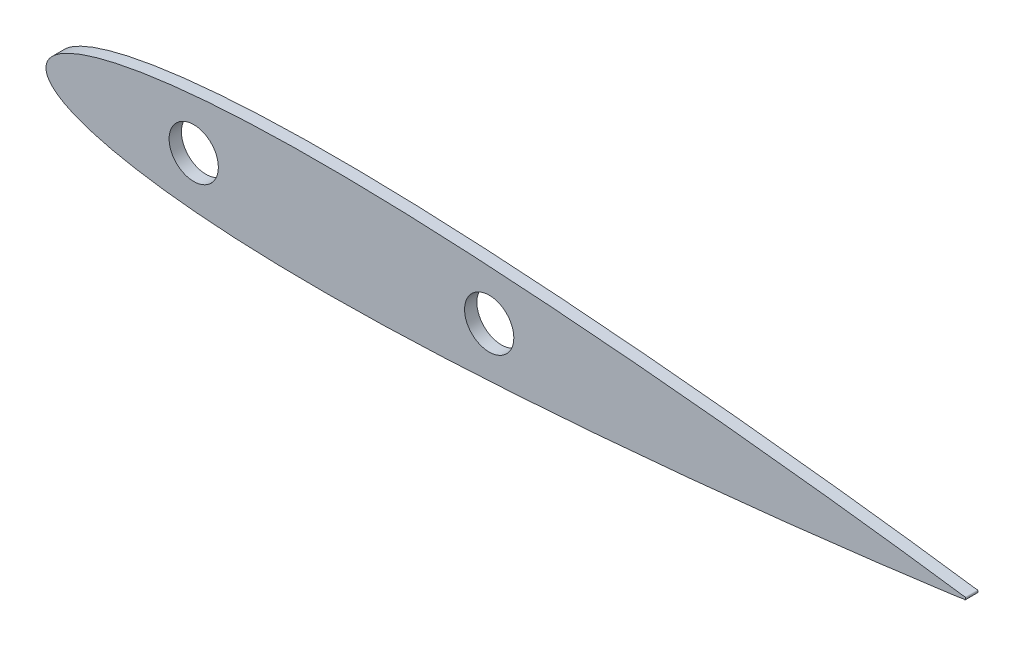
ISO-10303-21;
HEADER;
FILE_DESCRIPTION(('STEP AP214'),'2;1');
FILE_NAME('part.step','',(''),(''),'','','');
FILE_SCHEMA(('AUTOMOTIVE_DESIGN { 1 0 10303 214 1 1 1 1 }'));
ENDSEC;
DATA;
#1=APPLICATION_CONTEXT('core data for automotive mechanical design processes');
#2=APPLICATION_PROTOCOL_DEFINITION('international standard','automotive_design',2000,#1);
#3=PRODUCT_CONTEXT('',#1,'mechanical');
#4=PRODUCT('Part','Part','',(#3));
#5=PRODUCT_RELATED_PRODUCT_CATEGORY('part','',(#4));
#6=PRODUCT_DEFINITION_FORMATION('','',#4);
#7=PRODUCT_DEFINITION_CONTEXT('part definition',#1,'design');
#8=PRODUCT_DEFINITION('design','',#6,#7);
#9=PRODUCT_DEFINITION_SHAPE('','',#8);
#10=(LENGTH_UNIT() NAMED_UNIT(*) SI_UNIT(.MILLI.,.METRE.));
#11=(NAMED_UNIT(*) PLANE_ANGLE_UNIT() SI_UNIT($,.RADIAN.));
#12=(NAMED_UNIT(*) SI_UNIT($,.STERADIAN.) SOLID_ANGLE_UNIT());
#13=UNCERTAINTY_MEASURE_WITH_UNIT(LENGTH_MEASURE(1.E-05),#10,'distance_accuracy_value','');
#14=(GEOMETRIC_REPRESENTATION_CONTEXT(3) GLOBAL_UNCERTAINTY_ASSIGNED_CONTEXT((#13)) GLOBAL_UNIT_ASSIGNED_CONTEXT((#10,
#11,#12)) REPRESENTATION_CONTEXT('',''));
#15=CARTESIAN_POINT('',(0.,0.,0.));
#16=DIRECTION('',(0.,0.,1.));
#17=DIRECTION('',(1.,0.,0.));
#18=AXIS2_PLACEMENT_3D('',#15,#16,#17);
#19=CARTESIAN_POINT('',(237.0836,0.298725336,-3.175));
#20=CARTESIAN_POINT('',(236.995594177064,0.372475408342833,-3.175));
#21=CARTESIAN_POINT('',(236.426976915333,0.302841036144174,-3.175));
#22=CARTESIAN_POINT('',(235.41441473791,0.58787825322186,-3.175));
#23=CARTESIAN_POINT('',(233.557510405931,0.764057301815469,-3.175));
#24=CARTESIAN_POINT('',(231.055978259044,1.14215915390771,-3.175));
#25=CARTESIAN_POINT('',(227.833630131041,1.56409556437414,-3.175));
#26=CARTESIAN_POINT('',(223.947681724934,2.08411279295066,-3.175));
#27=CARTESIAN_POINT('',(219.408243113523,2.67194286821277,-3.175));
#28=CARTESIAN_POINT('',(214.248186400854,3.3264154433565,-3.175));
#29=CARTESIAN_POINT('',(208.497669056434,4.03606524010362,-3.175));
#30=CARTESIAN_POINT('',(202.192664292081,4.79128816807731,-3.175));
#31=CARTESIAN_POINT('',(195.371926846981,5.5827172587729,-3.175));
#32=CARTESIAN_POINT('',(188.077459080505,6.39957740326463,-3.175));
#33=CARTESIAN_POINT('',(180.354259346135,7.23189540042881,-3.175));
#34=CARTESIAN_POINT('',(172.249998357399,8.06933375412243,-3.175));
#35=CARTESIAN_POINT('',(163.814621862154,8.90108319346206,-3.175));
#36=CARTESIAN_POINT('',(155.100159759816,9.71546845477633,-3.175));
#37=CARTESIAN_POINT('',(146.160279483536,10.5017983401667,-3.175));
#38=CARTESIAN_POINT('',(137.050196099232,11.2469268213346,-3.175));
#39=CARTESIAN_POINT('',(127.825887084772,11.938704548657,-3.175));
#40=CARTESIAN_POINT('',(118.544307175963,12.564288116668,-3.175));
#41=CARTESIAN_POINT('',(109.262643888939,13.1105971127119,-3.175));
#42=CARTESIAN_POINT('',(100.038037253464,13.563829728713,-3.175));
#43=CARTESIAN_POINT('',(90.9274581455417,13.9119000953402,-3.175));
#44=CARTESIAN_POINT('',(81.9868134878278,14.1434528505076,-3.175));
#45=CARTESIAN_POINT('',(73.2713546398796,14.2471780807204,-3.175));
#46=CARTESIAN_POINT('',(64.8346344903156,14.2148441078441,-3.175));
#47=CARTESIAN_POINT('',(56.7286676185947,14.0402053636085,-3.175));
#48=CARTESIAN_POINT('',(49.0033499510361,13.7188349467634,-3.175));
#49=CARTESIAN_POINT('',(41.7062322985072,13.2498922023958,-3.175));
#50=CARTESIAN_POINT('',(34.8821630118159,12.6347881482418,-3.175));
#51=CARTESIAN_POINT('',(28.5729005372088,11.8783267733156,-3.175));
#52=CARTESIAN_POINT('',(22.8169018512922,10.9869444443621,-3.175));
#53=CARTESIAN_POINT('',(17.6490469137659,9.96995088795665,-3.175));
#54=CARTESIAN_POINT('',(13.0996252335267,8.83884552174934,-3.175));
#55=CARTESIAN_POINT('',(9.19448859826564,7.60465803357858,-3.175));
#56=CARTESIAN_POINT('',(5.95347766425118,6.27888316579985,-3.175));
#57=CARTESIAN_POINT('',(3.38692810552131,4.87049040865518,-3.175));
#58=CARTESIAN_POINT('',(1.49878923010834,3.37670002922291,-3.175));
#59=CARTESIAN_POINT('',(0.289451642221712,1.76137384384579,-3.175));
#60=CARTESIAN_POINT('',(-0.134894756530488,0.,-3.175));
#61=CARTESIAN_POINT('',(0.289451642221708,-1.76137384384578,-3.175));
#62=CARTESIAN_POINT('',(1.49878923010833,-3.3767000292229,-3.175));
#63=CARTESIAN_POINT('',(3.38692810552134,-4.8704904086552,-3.175));
#64=CARTESIAN_POINT('',(5.95347766425114,-6.27888316579983,-3.175));
#65=CARTESIAN_POINT('',(9.19448859826567,-7.60465803357859,-3.175));
#66=CARTESIAN_POINT('',(13.0996252335267,-8.83884552174934,-3.175));
#67=CARTESIAN_POINT('',(17.6490469137659,-9.96995088795666,-3.175));
#68=CARTESIAN_POINT('',(22.8169018512922,-10.9869444443621,-3.175));
#69=CARTESIAN_POINT('',(28.5729005372088,-11.8783267733156,-3.175));
#70=CARTESIAN_POINT('',(34.8821630118159,-12.6347881482418,-3.175));
#71=CARTESIAN_POINT('',(41.7062322985073,-13.2498922023958,-3.175));
#72=CARTESIAN_POINT('',(49.0033499510361,-13.7188349467634,-3.175));
#73=CARTESIAN_POINT('',(56.7286676185946,-14.0402053636085,-3.175));
#74=CARTESIAN_POINT('',(64.8346344903157,-14.2148441078441,-3.175));
#75=CARTESIAN_POINT('',(73.2713546398795,-14.2471780807204,-3.175));
#76=CARTESIAN_POINT('',(81.9868134878278,-14.1434528505076,-3.175));
#77=CARTESIAN_POINT('',(90.9274581455417,-13.9119000953402,-3.175));
#78=CARTESIAN_POINT('',(100.038037253464,-13.563829728713,-3.175));
#79=CARTESIAN_POINT('',(109.262643888939,-13.1105971127119,-3.175));
#80=CARTESIAN_POINT('',(118.544307175963,-12.564288116668,-3.175));
#81=CARTESIAN_POINT('',(127.825887084772,-11.938704548657,-3.175));
#82=CARTESIAN_POINT('',(137.050196099232,-11.2469268213346,-3.175));
#83=CARTESIAN_POINT('',(146.160279483536,-10.5017983401667,-3.175));
#84=CARTESIAN_POINT('',(155.100159759816,-9.71546845477633,-3.175));
#85=CARTESIAN_POINT('',(163.814621862154,-8.90108319346206,-3.175));
#86=CARTESIAN_POINT('',(172.249998357399,-8.06933375412243,-3.175));
#87=CARTESIAN_POINT('',(180.354259346135,-7.23189540042882,-3.175));
#88=CARTESIAN_POINT('',(188.077459080506,-6.39957740326463,-3.175));
#89=CARTESIAN_POINT('',(195.371926846981,-5.5827172587729,-3.175));
#90=CARTESIAN_POINT('',(202.192664292081,-4.79128816807731,-3.175));
#91=CARTESIAN_POINT('',(208.497669056435,-4.03606524010363,-3.175));
#92=CARTESIAN_POINT('',(214.248186400854,-3.32641544335649,-3.175));
#93=CARTESIAN_POINT('',(219.408243113523,-2.67194286821277,-3.175));
#94=CARTESIAN_POINT('',(223.947681724933,-2.08411279295066,-3.175));
#95=CARTESIAN_POINT('',(227.833630131041,-1.56409556437413,-3.175));
#96=CARTESIAN_POINT('',(231.055978259044,-1.14215915390771,-3.175));
#97=CARTESIAN_POINT('',(233.557510405931,-0.764057301815473,-3.175));
#98=CARTESIAN_POINT('',(235.41441473791,-0.587878253221858,-3.175));
#99=CARTESIAN_POINT('',(236.426976915333,-0.302841036144166,-3.175));
#100=CARTESIAN_POINT('',(237.226122794749,-0.400706551937491,-3.175));
#101=CARTESIAN_POINT('',(237.226122794749,0.179289302422103,-3.175));
#102=CARTESIAN_POINT('',(237.0836,0.298725336,-3.175));
#103=B_SPLINE_CURVE_WITH_KNOTS('',3,(#19,#20,#21,#22,#23,#24,#25,#26,#27,#28,#29,#30,#31,#32,
#33,#34,#35,#36,#37,#38,#39,#40,#41,#42,#43,#44,#45,#46,#47,#48,#49,#50,#51,#52,#53,#54,#55,#56,
#57,#58,#59,#60,#61,#62,#63,#64,#65,#66,#67,#68,#69,#70,#71,#72,#73,#74,#75,#76,#77,#78,#79,#80,
#81,#82,#83,#84,#85,#86,#87,#88,#89,#90,#91,#92,#93,#94,#95,#96,#97,#98,#99,#100,#101,#102),
.UNSPECIFIED.,.T.,.F.,(4,1,1,1,1,1,1,1,1,1,1,1,1,1,1,1,1,1,1,1,1,1,1,1,1,1,1,1,1,1,1,1,1,1,1,1,
1,1,1,1,1,1,1,1,1,1,1,1,1,1,1,1,1,1,1,1,1,1,1,1,1,1,1,1,1,1,1,1,1,1,1,1,1,1,1,1,1,1,1,1,1,4),
(0.,0.000762214651028519,0.00304470631082171,0.00683224554312913,0.0121011758037585,
0.0188175356586858,0.026939454793122,0.0364148482585567,0.0471846285955963,0.0591804130998147,
0.0723278736139124,0.0865440610891482,0.101740580336553,0.117823336433574,0.134691452208322,
0.152240154447154,0.170361289964637,0.188941007849542,0.207865435445639,0.227016078022501,
0.246275695980001,0.265524943249895,0.284644966110444,0.303520118268661,0.322034575374331,
0.340078352914118,0.357542593241702,0.374325481920834,0.390329890871888,0.405463889739095,
0.419643801445685,0.43279337139134,0.444843816743186,0.455737920704734,0.465428653233084,
0.473886320085416,0.481101634077568,0.487101684418678,0.491975368345093,0.495930677807379,
0.499382808099288,0.502834938391198,0.506790247853484,0.511663931779898,0.517663982121008,
0.524879296113161,0.533336962965492,0.543027695493843,0.553921799455391,0.565972244807237,
0.579121814752892,0.593301726459482,0.608435725326689,0.624440134277742,0.641223022956875,
0.658687263284458,0.676731040824245,0.695245497929915,0.714120650088133,0.733240672948681,
0.752489920218576,0.771749538176075,0.790900180752937,0.809824608349034,0.82840432623394,
0.846525461751422,0.864074163990254,0.880942279765002,0.897025035862024,0.912221555109428,
0.926437742584664,0.939585203098762,0.95158098760298,0.96235076794002,0.971826161405454,
0.97994808053989,0.986664440394818,0.991933370655447,0.995720909887755,0.998003401547548,
0.998765616198576,1.),.UNSPECIFIED.);
#104=DIRECTION('',(0.,0.,1.));
#105=VECTOR('',#104,1.);
#106=SURFACE_OF_LINEAR_EXTRUSION('',#103,#105);
#107=CARTESIAN_POINT('',(237.0836,0.298725336,-3.175));
#108=VERTEX_POINT('',#107);
#109=EDGE_CURVE('E10',#108,#108,#103,.T.);
#110=ORIENTED_EDGE('',*,*,#109,.T.);
#111=EDGE_LOOP('',(#110));
#112=FACE_BOUND('',#111,.T.);
#113=CARTESIAN_POINT('',(237.0836,0.298725336,0.));
#114=CARTESIAN_POINT('',(236.995594177064,0.372475408342833,0.));
#115=CARTESIAN_POINT('',(236.426976915333,0.302841036144174,0.));
#116=CARTESIAN_POINT('',(235.41441473791,0.58787825322186,0.));
#117=CARTESIAN_POINT('',(233.557510405931,0.764057301815469,0.));
#118=CARTESIAN_POINT('',(231.055978259044,1.14215915390771,0.));
#119=CARTESIAN_POINT('',(227.833630131041,1.56409556437414,0.));
#120=CARTESIAN_POINT('',(223.947681724934,2.08411279295066,0.));
#121=CARTESIAN_POINT('',(219.408243113523,2.67194286821277,0.));
#122=CARTESIAN_POINT('',(214.248186400854,3.3264154433565,0.));
#123=CARTESIAN_POINT('',(208.497669056434,4.03606524010362,0.));
#124=CARTESIAN_POINT('',(202.192664292081,4.79128816807731,0.));
#125=CARTESIAN_POINT('',(195.371926846981,5.5827172587729,0.));
#126=CARTESIAN_POINT('',(188.077459080505,6.39957740326463,0.));
#127=CARTESIAN_POINT('',(180.354259346135,7.23189540042881,0.));
#128=CARTESIAN_POINT('',(172.249998357399,8.06933375412243,0.));
#129=CARTESIAN_POINT('',(163.814621862154,8.90108319346206,0.));
#130=CARTESIAN_POINT('',(155.100159759816,9.71546845477633,0.));
#131=CARTESIAN_POINT('',(146.160279483536,10.5017983401667,0.));
#132=CARTESIAN_POINT('',(137.050196099232,11.2469268213346,0.));
#133=CARTESIAN_POINT('',(127.825887084772,11.938704548657,0.));
#134=CARTESIAN_POINT('',(118.544307175963,12.564288116668,0.));
#135=CARTESIAN_POINT('',(109.262643888939,13.1105971127119,0.));
#136=CARTESIAN_POINT('',(100.038037253464,13.563829728713,0.));
#137=CARTESIAN_POINT('',(90.9274581455417,13.9119000953402,0.));
#138=CARTESIAN_POINT('',(81.9868134878278,14.1434528505076,0.));
#139=CARTESIAN_POINT('',(73.2713546398796,14.2471780807204,0.));
#140=CARTESIAN_POINT('',(64.8346344903156,14.2148441078441,0.));
#141=CARTESIAN_POINT('',(56.7286676185947,14.0402053636085,0.));
#142=CARTESIAN_POINT('',(49.0033499510361,13.7188349467634,0.));
#143=CARTESIAN_POINT('',(41.7062322985072,13.2498922023958,0.));
#144=CARTESIAN_POINT('',(34.8821630118159,12.6347881482418,0.));
#145=CARTESIAN_POINT('',(28.5729005372088,11.8783267733156,0.));
#146=CARTESIAN_POINT('',(22.8169018512922,10.9869444443621,0.));
#147=CARTESIAN_POINT('',(17.6490469137659,9.96995088795665,0.));
#148=CARTESIAN_POINT('',(13.0996252335267,8.83884552174934,0.));
#149=CARTESIAN_POINT('',(9.19448859826564,7.60465803357858,0.));
#150=CARTESIAN_POINT('',(5.95347766425118,6.27888316579985,0.));
#151=CARTESIAN_POINT('',(3.38692810552131,4.87049040865518,0.));
#152=CARTESIAN_POINT('',(1.49878923010834,3.37670002922291,0.));
#153=CARTESIAN_POINT('',(0.289451642221712,1.76137384384579,0.));
#154=CARTESIAN_POINT('',(-0.134894756530488,0.,0.));
#155=CARTESIAN_POINT('',(0.289451642221708,-1.76137384384578,0.));
#156=CARTESIAN_POINT('',(1.49878923010833,-3.3767000292229,0.));
#157=CARTESIAN_POINT('',(3.38692810552134,-4.8704904086552,0.));
#158=CARTESIAN_POINT('',(5.95347766425114,-6.27888316579983,0.));
#159=CARTESIAN_POINT('',(9.19448859826567,-7.60465803357859,0.));
#160=CARTESIAN_POINT('',(13.0996252335267,-8.83884552174934,0.));
#161=CARTESIAN_POINT('',(17.6490469137659,-9.96995088795666,0.));
#162=CARTESIAN_POINT('',(22.8169018512922,-10.9869444443621,0.));
#163=CARTESIAN_POINT('',(28.5729005372088,-11.8783267733156,0.));
#164=CARTESIAN_POINT('',(34.8821630118159,-12.6347881482418,0.));
#165=CARTESIAN_POINT('',(41.7062322985073,-13.2498922023958,0.));
#166=CARTESIAN_POINT('',(49.0033499510361,-13.7188349467634,0.));
#167=CARTESIAN_POINT('',(56.7286676185946,-14.0402053636085,0.));
#168=CARTESIAN_POINT('',(64.8346344903157,-14.2148441078441,0.));
#169=CARTESIAN_POINT('',(73.2713546398795,-14.2471780807204,0.));
#170=CARTESIAN_POINT('',(81.9868134878278,-14.1434528505076,0.));
#171=CARTESIAN_POINT('',(90.9274581455417,-13.9119000953402,0.));
#172=CARTESIAN_POINT('',(100.038037253464,-13.563829728713,0.));
#173=CARTESIAN_POINT('',(109.262643888939,-13.1105971127119,0.));
#174=CARTESIAN_POINT('',(118.544307175963,-12.564288116668,0.));
#175=CARTESIAN_POINT('',(127.825887084772,-11.938704548657,0.));
#176=CARTESIAN_POINT('',(137.050196099232,-11.2469268213346,0.));
#177=CARTESIAN_POINT('',(146.160279483536,-10.5017983401667,0.));
#178=CARTESIAN_POINT('',(155.100159759816,-9.71546845477633,0.));
#179=CARTESIAN_POINT('',(163.814621862154,-8.90108319346206,0.));
#180=CARTESIAN_POINT('',(172.249998357399,-8.06933375412243,0.));
#181=CARTESIAN_POINT('',(180.354259346135,-7.23189540042882,0.));
#182=CARTESIAN_POINT('',(188.077459080506,-6.39957740326463,0.));
#183=CARTESIAN_POINT('',(195.371926846981,-5.5827172587729,0.));
#184=CARTESIAN_POINT('',(202.192664292081,-4.79128816807731,0.));
#185=CARTESIAN_POINT('',(208.497669056435,-4.03606524010363,0.));
#186=CARTESIAN_POINT('',(214.248186400854,-3.32641544335649,0.));
#187=CARTESIAN_POINT('',(219.408243113523,-2.67194286821277,0.));
#188=CARTESIAN_POINT('',(223.947681724933,-2.08411279295066,0.));
#189=CARTESIAN_POINT('',(227.833630131041,-1.56409556437413,0.));
#190=CARTESIAN_POINT('',(231.055978259044,-1.14215915390771,0.));
#191=CARTESIAN_POINT('',(233.557510405931,-0.764057301815473,0.));
#192=CARTESIAN_POINT('',(235.41441473791,-0.587878253221858,0.));
#193=CARTESIAN_POINT('',(236.426976915333,-0.302841036144166,0.));
#194=CARTESIAN_POINT('',(237.226122794749,-0.400706551937491,0.));
#195=CARTESIAN_POINT('',(237.226122794749,0.179289302422103,0.));
#196=CARTESIAN_POINT('',(237.0836,0.298725336,0.));
#197=B_SPLINE_CURVE_WITH_KNOTS('',3,(#113,#114,#115,#116,#117,#118,#119,#120,#121,#122,#123,
#124,#125,#126,#127,#128,#129,#130,#131,#132,#133,#134,#135,#136,#137,#138,#139,#140,#141,#142,
#143,#144,#145,#146,#147,#148,#149,#150,#151,#152,#153,#154,#155,#156,#157,#158,#159,#160,#161,
#162,#163,#164,#165,#166,#167,#168,#169,#170,#171,#172,#173,#174,#175,#176,#177,#178,#179,#180,
#181,#182,#183,#184,#185,#186,#187,#188,#189,#190,#191,#192,#193,#194,#195,#196),.UNSPECIFIED.,
.T.,.F.,(4,1,1,1,1,1,1,1,1,1,1,1,1,1,1,1,1,1,1,1,1,1,1,1,1,1,1,1,1,1,1,1,1,1,1,1,1,1,1,1,1,1,1,
1,1,1,1,1,1,1,1,1,1,1,1,1,1,1,1,1,1,1,1,1,1,1,1,1,1,1,1,1,1,1,1,1,1,1,1,1,1,4),(0.,
0.000762214651028519,0.00304470631082171,0.00683224554312913,0.0121011758037585,
0.0188175356586858,0.026939454793122,0.0364148482585567,0.0471846285955963,0.0591804130998147,
0.0723278736139124,0.0865440610891482,0.101740580336553,0.117823336433574,0.134691452208322,
0.152240154447154,0.170361289964637,0.188941007849542,0.207865435445639,0.227016078022501,
0.246275695980001,0.265524943249895,0.284644966110444,0.303520118268661,0.322034575374331,
0.340078352914118,0.357542593241702,0.374325481920834,0.390329890871888,0.405463889739095,
0.419643801445685,0.43279337139134,0.444843816743186,0.455737920704734,0.465428653233084,
0.473886320085416,0.481101634077568,0.487101684418678,0.491975368345093,0.495930677807379,
0.499382808099288,0.502834938391198,0.506790247853484,0.511663931779898,0.517663982121008,
0.524879296113161,0.533336962965492,0.543027695493843,0.553921799455391,0.565972244807237,
0.579121814752892,0.593301726459482,0.608435725326689,0.624440134277742,0.641223022956875,
0.658687263284458,0.676731040824245,0.695245497929915,0.714120650088133,0.733240672948681,
0.752489920218576,0.771749538176075,0.790900180752937,0.809824608349034,0.82840432623394,
0.846525461751422,0.864074163990254,0.880942279765002,0.897025035862024,0.912221555109428,
0.926437742584664,0.939585203098762,0.95158098760298,0.96235076794002,0.971826161405454,
0.97994808053989,0.986664440394818,0.991933370655447,0.995720909887755,0.998003401547548,
0.998765616198576,1.),.UNSPECIFIED.);
#198=CARTESIAN_POINT('',(237.0836,0.298725336,0.));
#199=VERTEX_POINT('',#198);
#200=EDGE_CURVE('E39',#199,#199,#197,.T.);
#201=ORIENTED_EDGE('',*,*,#200,.F.);
#202=EDGE_LOOP('',(#201));
#203=FACE_BOUND('',#202,.T.);
#204=ADVANCED_FACE('F35',(#112,#203),#106,.T.);
#205=CARTESIAN_POINT('',(0.0127106653053449,-0.30003537656043,-3.175));
#206=DIRECTION('',(0.,0.,1.));
#207=DIRECTION('',(-1.,0.,0.));
#208=AXIS2_PLACEMENT_3D('',#205,#206,#207);
#209=PLANE('',#208);
#210=CARTESIAN_POINT('',(38.1,0.,-3.175));
#211=DIRECTION('',(0.,0.,1.));
#212=DIRECTION('',(1.,0.,0.));
#213=AXIS2_PLACEMENT_3D('',#210,#211,#212);
#214=CIRCLE('',#213,6.35);
#215=CARTESIAN_POINT('',(44.45,0.,-3.175));
#216=VERTEX_POINT('',#215);
#217=EDGE_CURVE('E61',#216,#216,#214,.T.);
#218=ORIENTED_EDGE('',*,*,#217,.T.);
#219=EDGE_LOOP('',(#218));
#220=FACE_BOUND('',#219,.T.);
#221=CARTESIAN_POINT('',(114.3,0.,-3.175));
#222=DIRECTION('',(0.,0.,1.));
#223=DIRECTION('',(1.,0.,0.));
#224=AXIS2_PLACEMENT_3D('',#221,#222,#223);
#225=CIRCLE('',#224,6.35);
#226=CARTESIAN_POINT('',(120.65,0.,-3.175));
#227=VERTEX_POINT('',#226);
#228=EDGE_CURVE('E52',#227,#227,#225,.T.);
#229=ORIENTED_EDGE('',*,*,#228,.T.);
#230=EDGE_LOOP('',(#229));
#231=FACE_BOUND('',#230,.T.);
#232=ORIENTED_EDGE('',*,*,#109,.F.);
#233=EDGE_LOOP('',(#232));
#234=FACE_BOUND('',#233,.T.);
#235=ADVANCED_FACE('F74',(#220,#231,#234),#209,.F.);
#236=CARTESIAN_POINT('',(0.0127106653053449,-0.30003537656043,0.));
#237=DIRECTION('',(0.,0.,1.));
#238=DIRECTION('',(-1.,0.,0.));
#239=AXIS2_PLACEMENT_3D('',#236,#237,#238);
#240=PLANE('',#239);
#241=CARTESIAN_POINT('',(38.1,0.,0.));
#242=DIRECTION('',(0.,0.,1.));
#243=DIRECTION('',(1.,0.,0.));
#244=AXIS2_PLACEMENT_3D('',#241,#242,#243);
#245=CIRCLE('',#244,6.35);
#246=CARTESIAN_POINT('',(44.45,0.,0.));
#247=VERTEX_POINT('',#246);
#248=EDGE_CURVE('E47',#247,#247,#245,.T.);
#249=ORIENTED_EDGE('',*,*,#248,.F.);
#250=EDGE_LOOP('',(#249));
#251=FACE_BOUND('',#250,.T.);
#252=CARTESIAN_POINT('',(114.3,0.,0.));
#253=DIRECTION('',(0.,0.,1.));
#254=DIRECTION('',(1.,0.,0.));
#255=AXIS2_PLACEMENT_3D('',#252,#253,#254);
#256=CIRCLE('',#255,6.35);
#257=CARTESIAN_POINT('',(120.65,0.,0.));
#258=VERTEX_POINT('',#257);
#259=EDGE_CURVE('E58',#258,#258,#256,.T.);
#260=ORIENTED_EDGE('',*,*,#259,.F.);
#261=EDGE_LOOP('',(#260));
#262=FACE_BOUND('',#261,.T.);
#263=ORIENTED_EDGE('',*,*,#200,.T.);
#264=EDGE_LOOP('',(#263));
#265=FACE_BOUND('',#264,.T.);
#266=ADVANCED_FACE('F70',(#251,#262,#265),#240,.T.);
#267=CARTESIAN_POINT('',(114.3,0.,0.));
#268=DIRECTION('',(0.,0.,-1.));
#269=DIRECTION('',(1.,0.,0.));
#270=AXIS2_PLACEMENT_3D('',#267,#268,#269);
#271=CYLINDRICAL_SURFACE('',#270,6.35);
#272=ORIENTED_EDGE('',*,*,#259,.T.);
#273=EDGE_LOOP('',(#272));
#274=FACE_BOUND('',#273,.T.);
#275=ORIENTED_EDGE('',*,*,#228,.F.);
#276=EDGE_LOOP('',(#275));
#277=FACE_BOUND('',#276,.T.);
#278=ADVANCED_FACE('F73',(#274,#277),#271,.F.);
#279=CARTESIAN_POINT('',(38.1,0.,0.));
#280=DIRECTION('',(0.,0.,-1.));
#281=DIRECTION('',(1.,0.,0.));
#282=AXIS2_PLACEMENT_3D('',#279,#280,#281);
#283=CYLINDRICAL_SURFACE('',#282,6.35);
#284=ORIENTED_EDGE('',*,*,#248,.T.);
#285=EDGE_LOOP('',(#284));
#286=FACE_BOUND('',#285,.T.);
#287=ORIENTED_EDGE('',*,*,#217,.F.);
#288=EDGE_LOOP('',(#287));
#289=FACE_BOUND('',#288,.T.);
#290=ADVANCED_FACE('F67',(#286,#289),#283,.F.);
#291=CLOSED_SHELL('',(#204,#235,#266,#278,#290));
#292=MANIFOLD_SOLID_BREP('B2',#291);
#293=ADVANCED_BREP_SHAPE_REPRESENTATION('',(#18,#292),#14);
#294=SHAPE_DEFINITION_REPRESENTATION(#9,#293);
ENDSEC;
END-ISO-10303-21;
